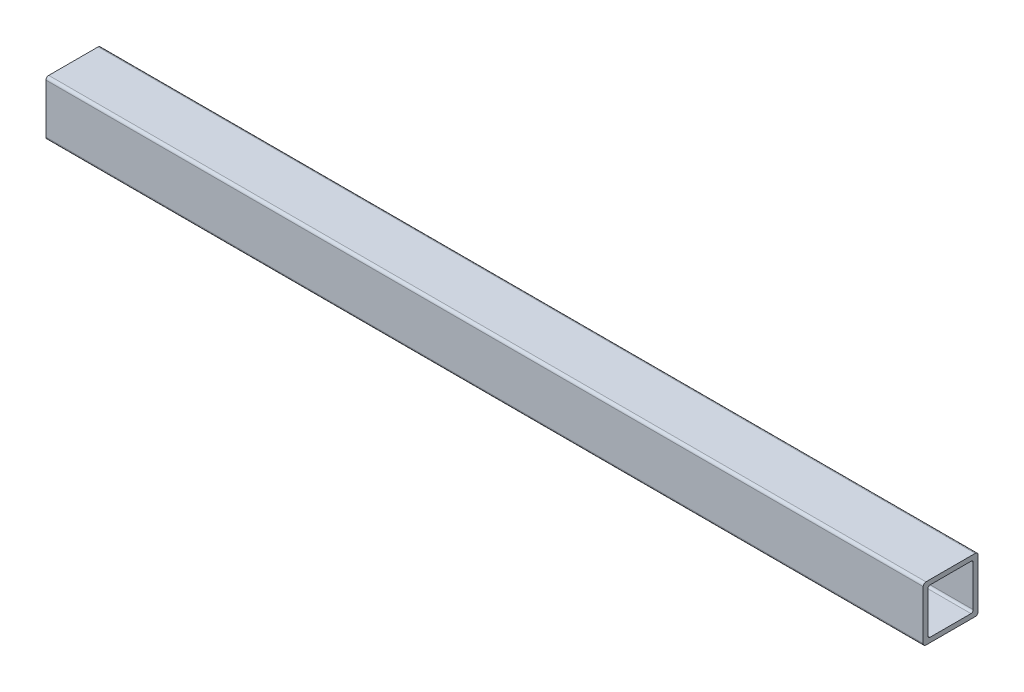
ISO-10303-21;
HEADER;
FILE_DESCRIPTION(('STEP AP214'),'2;1');
FILE_NAME('part.step','',(''),(''),'','','');
FILE_SCHEMA(('AUTOMOTIVE_DESIGN { 1 0 10303 214 1 1 1 1 }'));
ENDSEC;
DATA;
#1=APPLICATION_CONTEXT('core data for automotive mechanical design processes');
#2=APPLICATION_PROTOCOL_DEFINITION('international standard','automotive_design',2000,#1);
#3=PRODUCT_CONTEXT('',#1,'mechanical');
#4=PRODUCT('Part','Part','',(#3));
#5=PRODUCT_RELATED_PRODUCT_CATEGORY('part','',(#4));
#6=PRODUCT_DEFINITION_FORMATION('','',#4);
#7=PRODUCT_DEFINITION_CONTEXT('part definition',#1,'design');
#8=PRODUCT_DEFINITION('design','',#6,#7);
#9=PRODUCT_DEFINITION_SHAPE('','',#8);
#10=(LENGTH_UNIT() NAMED_UNIT(*) SI_UNIT(.MILLI.,.METRE.));
#11=(NAMED_UNIT(*) PLANE_ANGLE_UNIT() SI_UNIT($,.RADIAN.));
#12=(NAMED_UNIT(*) SI_UNIT($,.STERADIAN.) SOLID_ANGLE_UNIT());
#13=UNCERTAINTY_MEASURE_WITH_UNIT(LENGTH_MEASURE(1.E-05),#10,'distance_accuracy_value','');
#14=(GEOMETRIC_REPRESENTATION_CONTEXT(3) GLOBAL_UNCERTAINTY_ASSIGNED_CONTEXT((#13)) GLOBAL_UNIT_ASSIGNED_CONTEXT((#10,
#11,#12)) REPRESENTATION_CONTEXT('',''));
#15=CARTESIAN_POINT('',(0.,0.,0.));
#16=DIRECTION('',(0.,0.,1.));
#17=DIRECTION('',(1.,0.,0.));
#18=AXIS2_PLACEMENT_3D('',#15,#16,#17);
#19=CARTESIAN_POINT('',(152.4,-8.5725,-8.57250000000001));
#20=DIRECTION('',(1.,0.,0.));
#21=DIRECTION('',(0.,0.,-1.));
#22=AXIS2_PLACEMENT_3D('',#19,#20,#21);
#23=PLANE('',#22);
#24=CARTESIAN_POINT('',(152.4,-8.5725,-8.57250000000001));
#25=DIRECTION('',(1.,0.,0.));
#26=DIRECTION('',(0.,0.,-1.));
#27=AXIS2_PLACEMENT_3D('',#24,#25,#26);
#28=CIRCLE('',#27,0.952499999999997);
#29=CARTESIAN_POINT('',(152.4,-9.525,-8.5725));
#30=VERTEX_POINT('',#29);
#31=CARTESIAN_POINT('',(152.4,-8.5725,-9.525));
#32=VERTEX_POINT('',#31);
#33=EDGE_CURVE('E158',#30,#32,#28,.T.);
#34=ORIENTED_EDGE('',*,*,#33,.T.);
#35=DIRECTION('',(0.,1.,0.));
#36=VECTOR('',#35,1.);
#37=CARTESIAN_POINT('',(152.4,-8.5725,-9.525));
#38=LINE('',#37,#36);
#39=CARTESIAN_POINT('',(152.4,8.5725,-9.525));
#40=VERTEX_POINT('',#39);
#41=EDGE_CURVE('E241',#32,#40,#38,.T.);
#42=ORIENTED_EDGE('',*,*,#41,.T.);
#43=CARTESIAN_POINT('',(152.4,8.5725,-8.5725));
#44=DIRECTION('',(1.,0.,0.));
#45=DIRECTION('',(0.,0.,-1.));
#46=AXIS2_PLACEMENT_3D('',#43,#44,#45);
#47=CIRCLE('',#46,0.9525);
#48=CARTESIAN_POINT('',(152.4,9.525,-8.5725));
#49=VERTEX_POINT('',#48);
#50=EDGE_CURVE('E243',#40,#49,#47,.T.);
#51=ORIENTED_EDGE('',*,*,#50,.T.);
#52=DIRECTION('',(0.,0.,1.));
#53=VECTOR('',#52,1.);
#54=CARTESIAN_POINT('',(152.4,9.525,-8.5725));
#55=LINE('',#54,#53);
#56=CARTESIAN_POINT('',(152.4,9.525,8.5725));
#57=VERTEX_POINT('',#56);
#58=EDGE_CURVE('E245',#49,#57,#55,.T.);
#59=ORIENTED_EDGE('',*,*,#58,.T.);
#60=CARTESIAN_POINT('',(152.4,8.5725,8.5725));
#61=DIRECTION('',(1.,0.,0.));
#62=DIRECTION('',(0.,0.,-1.));
#63=AXIS2_PLACEMENT_3D('',#60,#61,#62);
#64=CIRCLE('',#63,0.952500000000002);
#65=CARTESIAN_POINT('',(152.4,8.5725,9.525));
#66=VERTEX_POINT('',#65);
#67=EDGE_CURVE('E247',#57,#66,#64,.T.);
#68=ORIENTED_EDGE('',*,*,#67,.T.);
#69=DIRECTION('',(0.,-1.,0.));
#70=VECTOR('',#69,1.);
#71=CARTESIAN_POINT('',(152.4,-8.5725,9.525));
#72=LINE('',#71,#70);
#73=CARTESIAN_POINT('',(152.4,-8.5725,9.525));
#74=VERTEX_POINT('',#73);
#75=EDGE_CURVE('E249',#66,#74,#72,.T.);
#76=ORIENTED_EDGE('',*,*,#75,.T.);
#77=CARTESIAN_POINT('',(152.4,-8.5725,8.5725));
#78=DIRECTION('',(1.,0.,0.));
#79=DIRECTION('',(0.,0.,-1.));
#80=AXIS2_PLACEMENT_3D('',#77,#78,#79);
#81=CIRCLE('',#80,0.952499999999998);
#82=CARTESIAN_POINT('',(152.4,-9.525,8.5725));
#83=VERTEX_POINT('',#82);
#84=EDGE_CURVE('E251',#74,#83,#81,.T.);
#85=ORIENTED_EDGE('',*,*,#84,.T.);
#86=DIRECTION('',(0.,0.,-1.));
#87=VECTOR('',#86,1.);
#88=CARTESIAN_POINT('',(152.4,-9.525,-8.5725));
#89=LINE('',#88,#87);
#90=EDGE_CURVE('E57',#83,#30,#89,.T.);
#91=ORIENTED_EDGE('',*,*,#90,.T.);
#92=EDGE_LOOP('',(#34,#42,#51,#59,#68,#76,#85,#91));
#93=FACE_BOUND('',#92,.T.);
#94=DIRECTION('',(0.,0.,1.));
#95=VECTOR('',#94,1.);
#96=CARTESIAN_POINT('',(152.4,7.874,-7.0866));
#97=LINE('',#96,#95);
#98=CARTESIAN_POINT('',(152.4,7.874,-7.0866));
#99=VERTEX_POINT('',#98);
#100=CARTESIAN_POINT('',(152.4,7.874,7.0866));
#101=VERTEX_POINT('',#100);
#102=EDGE_CURVE('E214',#99,#101,#97,.T.);
#103=ORIENTED_EDGE('',*,*,#102,.F.);
#104=CARTESIAN_POINT('',(152.4,7.0866,-7.0866));
#105=DIRECTION('',(1.,0.,0.));
#106=DIRECTION('',(0.,0.,-1.));
#107=AXIS2_PLACEMENT_3D('',#104,#105,#106);
#108=CIRCLE('',#107,0.787399999999998);
#109=CARTESIAN_POINT('',(152.4,7.0866,-7.874));
#110=VERTEX_POINT('',#109);
#111=EDGE_CURVE('E155',#110,#99,#108,.T.);
#112=ORIENTED_EDGE('',*,*,#111,.F.);
#113=DIRECTION('',(0.,1.,0.));
#114=VECTOR('',#113,1.);
#115=CARTESIAN_POINT('',(152.4,7.0866,-7.874));
#116=LINE('',#115,#114);
#117=CARTESIAN_POINT('',(152.4,-7.0866,-7.874));
#118=VERTEX_POINT('',#117);
#119=EDGE_CURVE('E226',#118,#110,#116,.T.);
#120=ORIENTED_EDGE('',*,*,#119,.F.);
#121=CARTESIAN_POINT('',(152.4,-7.0866,-7.0866));
#122=DIRECTION('',(1.,0.,0.));
#123=DIRECTION('',(0.,0.,-1.));
#124=AXIS2_PLACEMENT_3D('',#121,#122,#123);
#125=CIRCLE('',#124,0.787399999999999);
#126=CARTESIAN_POINT('',(152.4,-7.874,-7.0866));
#127=VERTEX_POINT('',#126);
#128=EDGE_CURVE('E224',#127,#118,#125,.T.);
#129=ORIENTED_EDGE('',*,*,#128,.F.);
#130=DIRECTION('',(0.,0.,-1.));
#131=VECTOR('',#130,1.);
#132=CARTESIAN_POINT('',(152.4,-7.874,-7.0866));
#133=LINE('',#132,#131);
#134=CARTESIAN_POINT('',(152.4,-7.874,7.0866));
#135=VERTEX_POINT('',#134);
#136=EDGE_CURVE('E222',#135,#127,#133,.T.);
#137=ORIENTED_EDGE('',*,*,#136,.F.);
#138=CARTESIAN_POINT('',(152.4,-7.0866,7.0866));
#139=DIRECTION('',(1.,0.,0.));
#140=DIRECTION('',(0.,0.,-1.));
#141=AXIS2_PLACEMENT_3D('',#138,#139,#140);
#142=CIRCLE('',#141,0.787399999999998);
#143=CARTESIAN_POINT('',(152.4,-7.0866,7.874));
#144=VERTEX_POINT('',#143);
#145=EDGE_CURVE('E220',#144,#135,#142,.T.);
#146=ORIENTED_EDGE('',*,*,#145,.F.);
#147=DIRECTION('',(0.,-1.,0.));
#148=VECTOR('',#147,1.);
#149=CARTESIAN_POINT('',(152.4,7.0866,7.874));
#150=LINE('',#149,#148);
#151=CARTESIAN_POINT('',(152.4,7.0866,7.874));
#152=VERTEX_POINT('',#151);
#153=EDGE_CURVE('E218',#152,#144,#150,.T.);
#154=ORIENTED_EDGE('',*,*,#153,.F.);
#155=CARTESIAN_POINT('',(152.4,7.0866,7.0866));
#156=DIRECTION('',(1.,0.,0.));
#157=DIRECTION('',(0.,0.,-1.));
#158=AXIS2_PLACEMENT_3D('',#155,#156,#157);
#159=CIRCLE('',#158,0.787400000000002);
#160=EDGE_CURVE('E216',#101,#152,#159,.T.);
#161=ORIENTED_EDGE('',*,*,#160,.F.);
#162=EDGE_LOOP('',(#103,#112,#120,#129,#137,#146,#154,#161));
#163=FACE_BOUND('',#162,.T.);
#164=ADVANCED_FACE('F34',(#93,#163),#23,.T.);
#165=CARTESIAN_POINT('',(152.4,-8.5725,-8.57250000000001));
#166=DIRECTION('',(-1.,0.,0.));
#167=DIRECTION('',(0.,0.,1.));
#168=AXIS2_PLACEMENT_3D('',#165,#166,#167);
#169=CYLINDRICAL_SURFACE('',#168,0.952499999999997);
#170=DIRECTION('',(-1.,0.,0.));
#171=VECTOR('',#170,1.);
#172=CARTESIAN_POINT('',(152.4,-9.525,-8.5725));
#173=LINE('',#172,#171);
#174=CARTESIAN_POINT('',(-152.4,-9.525,-8.5725));
#175=VERTEX_POINT('',#174);
#176=EDGE_CURVE('E254',#30,#175,#173,.T.);
#177=ORIENTED_EDGE('',*,*,#176,.T.);
#178=CARTESIAN_POINT('',(-152.4,-8.5725,-8.57250000000001));
#179=DIRECTION('',(1.,0.,0.));
#180=DIRECTION('',(0.,0.,-1.));
#181=AXIS2_PLACEMENT_3D('',#178,#179,#180);
#182=CIRCLE('',#181,0.952499999999997);
#183=CARTESIAN_POINT('',(-152.4,-8.5725,-9.525));
#184=VERTEX_POINT('',#183);
#185=EDGE_CURVE('E189',#175,#184,#182,.T.);
#186=ORIENTED_EDGE('',*,*,#185,.T.);
#187=DIRECTION('',(-1.,0.,0.));
#188=VECTOR('',#187,1.);
#189=CARTESIAN_POINT('',(152.4,-8.5725,-9.525));
#190=LINE('',#189,#188);
#191=EDGE_CURVE('E11',#32,#184,#190,.T.);
#192=ORIENTED_EDGE('',*,*,#191,.F.);
#193=ORIENTED_EDGE('',*,*,#33,.F.);
#194=EDGE_LOOP('',(#177,#186,#192,#193));
#195=FACE_BOUND('',#194,.T.);
#196=ADVANCED_FACE('F36',(#195),#169,.T.);
#197=CARTESIAN_POINT('',(152.4,-8.5725,-9.525));
#198=DIRECTION('',(0.,0.,1.));
#199=DIRECTION('',(1.,0.,0.));
#200=AXIS2_PLACEMENT_3D('',#197,#198,#199);
#201=PLANE('',#200);
#202=ORIENTED_EDGE('',*,*,#191,.T.);
#203=DIRECTION('',(0.,1.,0.));
#204=VECTOR('',#203,1.);
#205=CARTESIAN_POINT('',(-152.4,-8.5725,-9.525));
#206=LINE('',#205,#204);
#207=CARTESIAN_POINT('',(-152.4,8.5725,-9.525));
#208=VERTEX_POINT('',#207);
#209=EDGE_CURVE('E192',#184,#208,#206,.T.);
#210=ORIENTED_EDGE('',*,*,#209,.T.);
#211=DIRECTION('',(-1.,0.,0.));
#212=VECTOR('',#211,1.);
#213=CARTESIAN_POINT('',(152.4,8.5725,-9.525));
#214=LINE('',#213,#212);
#215=EDGE_CURVE('E42',#40,#208,#214,.T.);
#216=ORIENTED_EDGE('',*,*,#215,.F.);
#217=ORIENTED_EDGE('',*,*,#41,.F.);
#218=EDGE_LOOP('',(#202,#210,#216,#217));
#219=FACE_BOUND('',#218,.T.);
#220=ADVANCED_FACE('F276',(#219),#201,.F.);
#221=CARTESIAN_POINT('',(152.4,8.5725,-8.5725));
#222=DIRECTION('',(-1.,0.,0.));
#223=DIRECTION('',(0.,0.,1.));
#224=AXIS2_PLACEMENT_3D('',#221,#222,#223);
#225=CYLINDRICAL_SURFACE('',#224,0.9525);
#226=ORIENTED_EDGE('',*,*,#215,.T.);
#227=CARTESIAN_POINT('',(-152.4,8.5725,-8.5725));
#228=DIRECTION('',(1.,0.,0.));
#229=DIRECTION('',(0.,0.,-1.));
#230=AXIS2_PLACEMENT_3D('',#227,#228,#229);
#231=CIRCLE('',#230,0.9525);
#232=CARTESIAN_POINT('',(-152.4,9.525,-8.5725));
#233=VERTEX_POINT('',#232);
#234=EDGE_CURVE('E195',#208,#233,#231,.T.);
#235=ORIENTED_EDGE('',*,*,#234,.T.);
#236=DIRECTION('',(-1.,0.,0.));
#237=VECTOR('',#236,1.);
#238=CARTESIAN_POINT('',(152.4,9.525,-8.5725));
#239=LINE('',#238,#237);
#240=EDGE_CURVE('E264',#49,#233,#239,.T.);
#241=ORIENTED_EDGE('',*,*,#240,.F.);
#242=ORIENTED_EDGE('',*,*,#50,.F.);
#243=EDGE_LOOP('',(#226,#235,#241,#242));
#244=FACE_BOUND('',#243,.T.);
#245=ADVANCED_FACE('F269',(#244),#225,.T.);
#246=CARTESIAN_POINT('',(152.4,9.525,-8.5725));
#247=DIRECTION('',(0.,-1.,0.));
#248=DIRECTION('',(0.,0.,-1.));
#249=AXIS2_PLACEMENT_3D('',#246,#247,#248);
#250=PLANE('',#249);
#251=ORIENTED_EDGE('',*,*,#240,.T.);
#252=DIRECTION('',(0.,0.,1.));
#253=VECTOR('',#252,1.);
#254=CARTESIAN_POINT('',(-152.4,9.525,-8.5725));
#255=LINE('',#254,#253);
#256=CARTESIAN_POINT('',(-152.4,9.525,8.5725));
#257=VERTEX_POINT('',#256);
#258=EDGE_CURVE('E198',#233,#257,#255,.T.);
#259=ORIENTED_EDGE('',*,*,#258,.T.);
#260=DIRECTION('',(-1.,0.,0.));
#261=VECTOR('',#260,1.);
#262=CARTESIAN_POINT('',(152.4,9.525,8.5725));
#263=LINE('',#262,#261);
#264=EDGE_CURVE('E262',#57,#257,#263,.T.);
#265=ORIENTED_EDGE('',*,*,#264,.F.);
#266=ORIENTED_EDGE('',*,*,#58,.F.);
#267=EDGE_LOOP('',(#251,#259,#265,#266));
#268=FACE_BOUND('',#267,.T.);
#269=ADVANCED_FACE('F299',(#268),#250,.F.);
#270=CARTESIAN_POINT('',(152.4,8.5725,8.5725));
#271=DIRECTION('',(-1.,0.,0.));
#272=DIRECTION('',(0.,0.,1.));
#273=AXIS2_PLACEMENT_3D('',#270,#271,#272);
#274=CYLINDRICAL_SURFACE('',#273,0.952500000000002);
#275=ORIENTED_EDGE('',*,*,#264,.T.);
#276=CARTESIAN_POINT('',(-152.4,8.5725,8.5725));
#277=DIRECTION('',(1.,0.,0.));
#278=DIRECTION('',(0.,0.,-1.));
#279=AXIS2_PLACEMENT_3D('',#276,#277,#278);
#280=CIRCLE('',#279,0.952500000000002);
#281=CARTESIAN_POINT('',(-152.4,8.5725,9.525));
#282=VERTEX_POINT('',#281);
#283=EDGE_CURVE('E201',#257,#282,#280,.T.);
#284=ORIENTED_EDGE('',*,*,#283,.T.);
#285=DIRECTION('',(-1.,0.,0.));
#286=VECTOR('',#285,1.);
#287=CARTESIAN_POINT('',(152.4,8.5725,9.525));
#288=LINE('',#287,#286);
#289=EDGE_CURVE('E260',#66,#282,#288,.T.);
#290=ORIENTED_EDGE('',*,*,#289,.F.);
#291=ORIENTED_EDGE('',*,*,#67,.F.);
#292=EDGE_LOOP('',(#275,#284,#290,#291));
#293=FACE_BOUND('',#292,.T.);
#294=ADVANCED_FACE('F296',(#293),#274,.T.);
#295=CARTESIAN_POINT('',(152.4,-8.5725,9.525));
#296=DIRECTION('',(0.,0.,-1.));
#297=DIRECTION('',(-1.,0.,0.));
#298=AXIS2_PLACEMENT_3D('',#295,#296,#297);
#299=PLANE('',#298);
#300=ORIENTED_EDGE('',*,*,#289,.T.);
#301=DIRECTION('',(0.,-1.,0.));
#302=VECTOR('',#301,1.);
#303=CARTESIAN_POINT('',(-152.4,-8.5725,9.525));
#304=LINE('',#303,#302);
#305=CARTESIAN_POINT('',(-152.4,-8.5725,9.525));
#306=VERTEX_POINT('',#305);
#307=EDGE_CURVE('E204',#282,#306,#304,.T.);
#308=ORIENTED_EDGE('',*,*,#307,.T.);
#309=DIRECTION('',(-1.,0.,0.));
#310=VECTOR('',#309,1.);
#311=CARTESIAN_POINT('',(152.4,-8.5725,9.525));
#312=LINE('',#311,#310);
#313=EDGE_CURVE('E258',#74,#306,#312,.T.);
#314=ORIENTED_EDGE('',*,*,#313,.F.);
#315=ORIENTED_EDGE('',*,*,#75,.F.);
#316=EDGE_LOOP('',(#300,#308,#314,#315));
#317=FACE_BOUND('',#316,.T.);
#318=ADVANCED_FACE('F291',(#317),#299,.F.);
#319=CARTESIAN_POINT('',(152.4,-8.5725,8.5725));
#320=DIRECTION('',(-1.,0.,0.));
#321=DIRECTION('',(0.,0.,1.));
#322=AXIS2_PLACEMENT_3D('',#319,#320,#321);
#323=CYLINDRICAL_SURFACE('',#322,0.952499999999998);
#324=ORIENTED_EDGE('',*,*,#313,.T.);
#325=CARTESIAN_POINT('',(-152.4,-8.5725,8.5725));
#326=DIRECTION('',(1.,0.,0.));
#327=DIRECTION('',(0.,0.,-1.));
#328=AXIS2_PLACEMENT_3D('',#325,#326,#327);
#329=CIRCLE('',#328,0.952499999999998);
#330=CARTESIAN_POINT('',(-152.4,-9.525,8.5725));
#331=VERTEX_POINT('',#330);
#332=EDGE_CURVE('E207',#306,#331,#329,.T.);
#333=ORIENTED_EDGE('',*,*,#332,.T.);
#334=DIRECTION('',(-1.,0.,0.));
#335=VECTOR('',#334,1.);
#336=CARTESIAN_POINT('',(152.4,-9.525,8.5725));
#337=LINE('',#336,#335);
#338=EDGE_CURVE('E256',#83,#331,#337,.T.);
#339=ORIENTED_EDGE('',*,*,#338,.F.);
#340=ORIENTED_EDGE('',*,*,#84,.F.);
#341=EDGE_LOOP('',(#324,#333,#339,#340));
#342=FACE_BOUND('',#341,.T.);
#343=ADVANCED_FACE('F287',(#342),#323,.T.);
#344=CARTESIAN_POINT('',(152.4,-9.525,-8.5725));
#345=DIRECTION('',(0.,1.,0.));
#346=DIRECTION('',(0.,0.,1.));
#347=AXIS2_PLACEMENT_3D('',#344,#345,#346);
#348=PLANE('',#347);
#349=ORIENTED_EDGE('',*,*,#338,.T.);
#350=DIRECTION('',(0.,0.,-1.));
#351=VECTOR('',#350,1.);
#352=CARTESIAN_POINT('',(-152.4,-9.525,-8.5725));
#353=LINE('',#352,#351);
#354=EDGE_CURVE('E210',#331,#175,#353,.T.);
#355=ORIENTED_EDGE('',*,*,#354,.T.);
#356=ORIENTED_EDGE('',*,*,#176,.F.);
#357=ORIENTED_EDGE('',*,*,#90,.F.);
#358=EDGE_LOOP('',(#349,#355,#356,#357));
#359=FACE_BOUND('',#358,.T.);
#360=ADVANCED_FACE('F283',(#359),#348,.F.);
#361=CARTESIAN_POINT('',(152.4,7.0866,-7.0866));
#362=DIRECTION('',(-1.,0.,0.));
#363=DIRECTION('',(0.,0.,1.));
#364=AXIS2_PLACEMENT_3D('',#361,#362,#363);
#365=CYLINDRICAL_SURFACE('',#364,0.787399999999998);
#366=DIRECTION('',(-1.,0.,0.));
#367=VECTOR('',#366,1.);
#368=CARTESIAN_POINT('',(152.4,7.874,-7.0866));
#369=LINE('',#368,#367);
#370=CARTESIAN_POINT('',(-152.4,7.874,-7.0866));
#371=VERTEX_POINT('',#370);
#372=EDGE_CURVE('E147',#99,#371,#369,.T.);
#373=ORIENTED_EDGE('',*,*,#372,.T.);
#374=CARTESIAN_POINT('',(-152.4,7.0866,-7.0866));
#375=DIRECTION('',(1.,0.,0.));
#376=DIRECTION('',(0.,0.,-1.));
#377=AXIS2_PLACEMENT_3D('',#374,#375,#376);
#378=CIRCLE('',#377,0.787399999999998);
#379=CARTESIAN_POINT('',(-152.4,7.0866,-7.874));
#380=VERTEX_POINT('',#379);
#381=EDGE_CURVE('E152',#380,#371,#378,.T.);
#382=ORIENTED_EDGE('',*,*,#381,.F.);
#383=DIRECTION('',(-1.,0.,0.));
#384=VECTOR('',#383,1.);
#385=CARTESIAN_POINT('',(152.4,7.0866,-7.874));
#386=LINE('',#385,#384);
#387=EDGE_CURVE('E228',#110,#380,#386,.T.);
#388=ORIENTED_EDGE('',*,*,#387,.F.);
#389=ORIENTED_EDGE('',*,*,#111,.T.);
#390=EDGE_LOOP('',(#373,#382,#388,#389));
#391=FACE_BOUND('',#390,.T.);
#392=ADVANCED_FACE('F149',(#391),#365,.F.);
#393=CARTESIAN_POINT('',(152.4,7.874,-7.0866));
#394=DIRECTION('',(0.,-1.,0.));
#395=DIRECTION('',(0.,0.,-1.));
#396=AXIS2_PLACEMENT_3D('',#393,#394,#395);
#397=PLANE('',#396);
#398=DIRECTION('',(-1.,0.,0.));
#399=VECTOR('',#398,1.);
#400=CARTESIAN_POINT('',(152.4,7.874,7.0866));
#401=LINE('',#400,#399);
#402=CARTESIAN_POINT('',(-152.4,7.874,7.0866));
#403=VERTEX_POINT('',#402);
#404=EDGE_CURVE('E159',#101,#403,#401,.T.);
#405=ORIENTED_EDGE('',*,*,#404,.T.);
#406=DIRECTION('',(0.,0.,1.));
#407=VECTOR('',#406,1.);
#408=CARTESIAN_POINT('',(-152.4,7.874,-7.0866));
#409=LINE('',#408,#407);
#410=EDGE_CURVE('E162',#371,#403,#409,.T.);
#411=ORIENTED_EDGE('',*,*,#410,.F.);
#412=ORIENTED_EDGE('',*,*,#372,.F.);
#413=ORIENTED_EDGE('',*,*,#102,.T.);
#414=EDGE_LOOP('',(#405,#411,#412,#413));
#415=FACE_BOUND('',#414,.T.);
#416=ADVANCED_FACE('F163',(#415),#397,.T.);
#417=CARTESIAN_POINT('',(152.4,7.0866,7.0866));
#418=DIRECTION('',(-1.,0.,0.));
#419=DIRECTION('',(0.,0.,1.));
#420=AXIS2_PLACEMENT_3D('',#417,#418,#419);
#421=CYLINDRICAL_SURFACE('',#420,0.787400000000002);
#422=DIRECTION('',(-1.,0.,0.));
#423=VECTOR('',#422,1.);
#424=CARTESIAN_POINT('',(152.4,7.0866,7.874));
#425=LINE('',#424,#423);
#426=CARTESIAN_POINT('',(-152.4,7.0866,7.874));
#427=VERTEX_POINT('',#426);
#428=EDGE_CURVE('E237',#152,#427,#425,.T.);
#429=ORIENTED_EDGE('',*,*,#428,.T.);
#430=CARTESIAN_POINT('',(-152.4,7.0866,7.0866));
#431=DIRECTION('',(1.,0.,0.));
#432=DIRECTION('',(0.,0.,-1.));
#433=AXIS2_PLACEMENT_3D('',#430,#431,#432);
#434=CIRCLE('',#433,0.787400000000002);
#435=EDGE_CURVE('E168',#403,#427,#434,.T.);
#436=ORIENTED_EDGE('',*,*,#435,.F.);
#437=ORIENTED_EDGE('',*,*,#404,.F.);
#438=ORIENTED_EDGE('',*,*,#160,.T.);
#439=EDGE_LOOP('',(#429,#436,#437,#438));
#440=FACE_BOUND('',#439,.T.);
#441=ADVANCED_FACE('F308',(#440),#421,.F.);
#442=CARTESIAN_POINT('',(152.4,7.0866,7.874));
#443=DIRECTION('',(0.,0.,-1.));
#444=DIRECTION('',(0.,1.,0.));
#445=AXIS2_PLACEMENT_3D('',#442,#443,#444);
#446=PLANE('',#445);
#447=DIRECTION('',(-1.,0.,0.));
#448=VECTOR('',#447,1.);
#449=CARTESIAN_POINT('',(152.4,-7.0866,7.874));
#450=LINE('',#449,#448);
#451=CARTESIAN_POINT('',(-152.4,-7.0866,7.874));
#452=VERTEX_POINT('',#451);
#453=EDGE_CURVE('E235',#144,#452,#450,.T.);
#454=ORIENTED_EDGE('',*,*,#453,.T.);
#455=DIRECTION('',(0.,-1.,0.));
#456=VECTOR('',#455,1.);
#457=CARTESIAN_POINT('',(-152.4,7.0866,7.874));
#458=LINE('',#457,#456);
#459=EDGE_CURVE('E177',#427,#452,#458,.T.);
#460=ORIENTED_EDGE('',*,*,#459,.F.);
#461=ORIENTED_EDGE('',*,*,#428,.F.);
#462=ORIENTED_EDGE('',*,*,#153,.T.);
#463=EDGE_LOOP('',(#454,#460,#461,#462));
#464=FACE_BOUND('',#463,.T.);
#465=ADVANCED_FACE('F313',(#464),#446,.T.);
#466=CARTESIAN_POINT('',(152.4,-7.0866,7.0866));
#467=DIRECTION('',(-1.,0.,0.));
#468=DIRECTION('',(0.,0.,1.));
#469=AXIS2_PLACEMENT_3D('',#466,#467,#468);
#470=CYLINDRICAL_SURFACE('',#469,0.787399999999998);
#471=DIRECTION('',(-1.,0.,0.));
#472=VECTOR('',#471,1.);
#473=CARTESIAN_POINT('',(152.4,-7.874,7.0866));
#474=LINE('',#473,#472);
#475=CARTESIAN_POINT('',(-152.4,-7.874,7.0866));
#476=VERTEX_POINT('',#475);
#477=EDGE_CURVE('E233',#135,#476,#474,.T.);
#478=ORIENTED_EDGE('',*,*,#477,.T.);
#479=CARTESIAN_POINT('',(-152.4,-7.0866,7.0866));
#480=DIRECTION('',(1.,0.,0.));
#481=DIRECTION('',(0.,0.,-1.));
#482=AXIS2_PLACEMENT_3D('',#479,#480,#481);
#483=CIRCLE('',#482,0.787399999999998);
#484=EDGE_CURVE('E180',#452,#476,#483,.T.);
#485=ORIENTED_EDGE('',*,*,#484,.F.);
#486=ORIENTED_EDGE('',*,*,#453,.F.);
#487=ORIENTED_EDGE('',*,*,#145,.T.);
#488=EDGE_LOOP('',(#478,#485,#486,#487));
#489=FACE_BOUND('',#488,.T.);
#490=ADVANCED_FACE('F317',(#489),#470,.F.);
#491=CARTESIAN_POINT('',(152.4,-7.874,-7.0866));
#492=DIRECTION('',(0.,1.,0.));
#493=DIRECTION('',(0.,0.,1.));
#494=AXIS2_PLACEMENT_3D('',#491,#492,#493);
#495=PLANE('',#494);
#496=DIRECTION('',(-1.,0.,0.));
#497=VECTOR('',#496,1.);
#498=CARTESIAN_POINT('',(152.4,-7.874,-7.0866));
#499=LINE('',#498,#497);
#500=CARTESIAN_POINT('',(-152.4,-7.874,-7.0866));
#501=VERTEX_POINT('',#500);
#502=EDGE_CURVE('E231',#127,#501,#499,.T.);
#503=ORIENTED_EDGE('',*,*,#502,.T.);
#504=DIRECTION('',(0.,0.,-1.));
#505=VECTOR('',#504,1.);
#506=CARTESIAN_POINT('',(-152.4,-7.874,-7.0866));
#507=LINE('',#506,#505);
#508=EDGE_CURVE('E183',#476,#501,#507,.T.);
#509=ORIENTED_EDGE('',*,*,#508,.F.);
#510=ORIENTED_EDGE('',*,*,#477,.F.);
#511=ORIENTED_EDGE('',*,*,#136,.T.);
#512=EDGE_LOOP('',(#503,#509,#510,#511));
#513=FACE_BOUND('',#512,.T.);
#514=ADVANCED_FACE('F322',(#513),#495,.T.);
#515=CARTESIAN_POINT('',(152.4,-7.0866,-7.0866));
#516=DIRECTION('',(-1.,0.,0.));
#517=DIRECTION('',(0.,0.,1.));
#518=AXIS2_PLACEMENT_3D('',#515,#516,#517);
#519=CYLINDRICAL_SURFACE('',#518,0.787399999999999);
#520=DIRECTION('',(-1.,0.,0.));
#521=VECTOR('',#520,1.);
#522=CARTESIAN_POINT('',(152.4,-7.0866,-7.874));
#523=LINE('',#522,#521);
#524=CARTESIAN_POINT('',(-152.4,-7.0866,-7.874));
#525=VERTEX_POINT('',#524);
#526=EDGE_CURVE('E49',#118,#525,#523,.T.);
#527=ORIENTED_EDGE('',*,*,#526,.T.);
#528=CARTESIAN_POINT('',(-152.4,-7.0866,-7.0866));
#529=DIRECTION('',(1.,0.,0.));
#530=DIRECTION('',(0.,0.,-1.));
#531=AXIS2_PLACEMENT_3D('',#528,#529,#530);
#532=CIRCLE('',#531,0.787399999999999);
#533=EDGE_CURVE('E186',#501,#525,#532,.T.);
#534=ORIENTED_EDGE('',*,*,#533,.F.);
#535=ORIENTED_EDGE('',*,*,#502,.F.);
#536=ORIENTED_EDGE('',*,*,#128,.T.);
#537=EDGE_LOOP('',(#527,#534,#535,#536));
#538=FACE_BOUND('',#537,.T.);
#539=ADVANCED_FACE('F326',(#538),#519,.F.);
#540=CARTESIAN_POINT('',(152.4,7.0866,-7.874));
#541=DIRECTION('',(0.,0.,1.));
#542=DIRECTION('',(1.,0.,0.));
#543=AXIS2_PLACEMENT_3D('',#540,#541,#542);
#544=PLANE('',#543);
#545=ORIENTED_EDGE('',*,*,#387,.T.);
#546=DIRECTION('',(0.,1.,0.));
#547=VECTOR('',#546,1.);
#548=CARTESIAN_POINT('',(-152.4,7.0866,-7.874));
#549=LINE('',#548,#547);
#550=EDGE_CURVE('E173',#525,#380,#549,.T.);
#551=ORIENTED_EDGE('',*,*,#550,.F.);
#552=ORIENTED_EDGE('',*,*,#526,.F.);
#553=ORIENTED_EDGE('',*,*,#119,.T.);
#554=EDGE_LOOP('',(#545,#551,#552,#553));
#555=FACE_BOUND('',#554,.T.);
#556=ADVANCED_FACE('F328',(#555),#544,.T.);
#557=CARTESIAN_POINT('',(-152.4,-8.5725,-8.57250000000001));
#558=DIRECTION('',(1.,0.,0.));
#559=DIRECTION('',(0.,0.,-1.));
#560=AXIS2_PLACEMENT_3D('',#557,#558,#559);
#561=PLANE('',#560);
#562=ORIENTED_EDGE('',*,*,#550,.T.);
#563=ORIENTED_EDGE('',*,*,#381,.T.);
#564=ORIENTED_EDGE('',*,*,#410,.T.);
#565=ORIENTED_EDGE('',*,*,#435,.T.);
#566=ORIENTED_EDGE('',*,*,#459,.T.);
#567=ORIENTED_EDGE('',*,*,#484,.T.);
#568=ORIENTED_EDGE('',*,*,#508,.T.);
#569=ORIENTED_EDGE('',*,*,#533,.T.);
#570=EDGE_LOOP('',(#562,#563,#564,#565,#566,#567,#568,#569));
#571=FACE_BOUND('',#570,.T.);
#572=ORIENTED_EDGE('',*,*,#185,.F.);
#573=ORIENTED_EDGE('',*,*,#354,.F.);
#574=ORIENTED_EDGE('',*,*,#332,.F.);
#575=ORIENTED_EDGE('',*,*,#307,.F.);
#576=ORIENTED_EDGE('',*,*,#283,.F.);
#577=ORIENTED_EDGE('',*,*,#258,.F.);
#578=ORIENTED_EDGE('',*,*,#234,.F.);
#579=ORIENTED_EDGE('',*,*,#209,.F.);
#580=EDGE_LOOP('',(#572,#573,#574,#575,#576,#577,#578,#579));
#581=FACE_BOUND('',#580,.T.);
#582=ADVANCED_FACE('F170',(#571,#581),#561,.F.);
#583=CLOSED_SHELL('',(#164,#196,#220,#245,#269,#294,#318,#343,#360,#392,#416,#441,#465,#490,
#514,#539,#556,#582));
#584=MANIFOLD_SOLID_BREP('B2',#583);
#585=ADVANCED_BREP_SHAPE_REPRESENTATION('',(#18,#584),#14);
#586=SHAPE_DEFINITION_REPRESENTATION(#9,#585);
ENDSEC;
END-ISO-10303-21;
